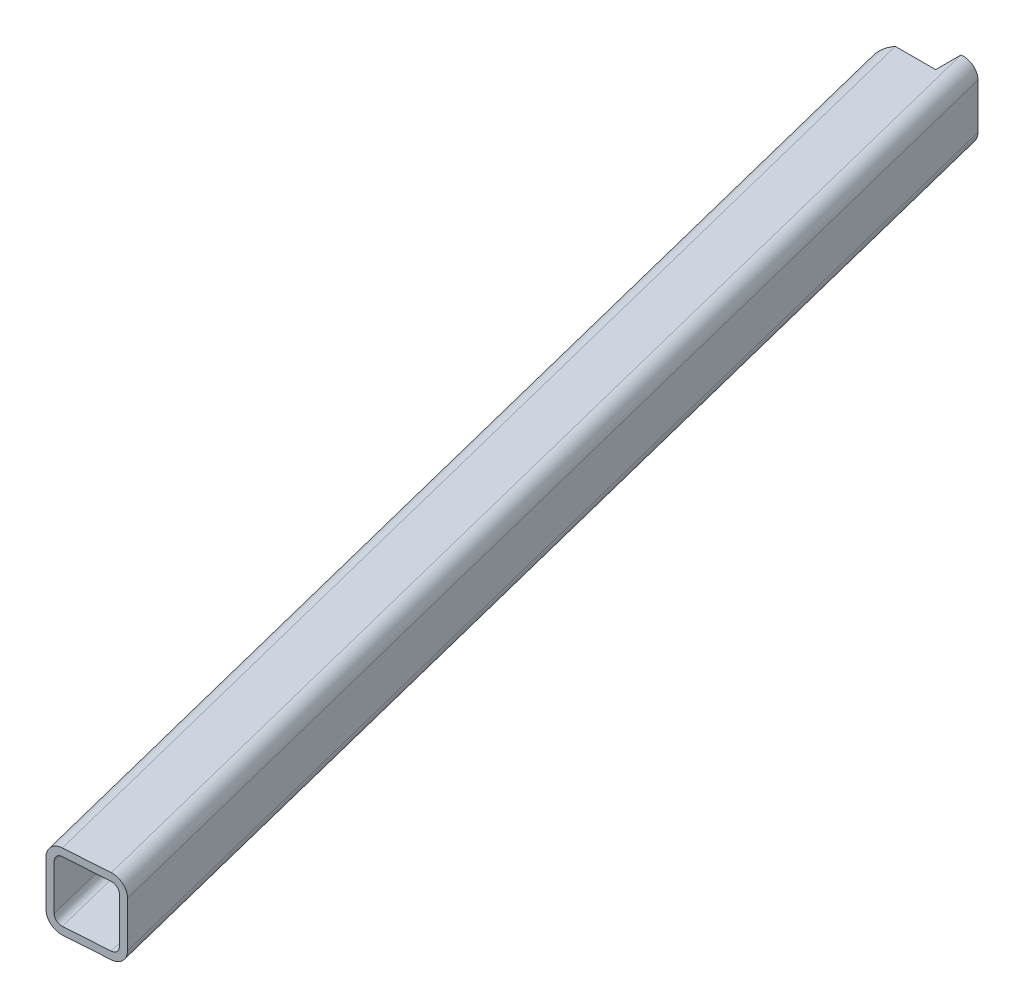
ISO-10303-21;
HEADER;
FILE_DESCRIPTION(('STEP AP214'),'2;1');
FILE_NAME('part.step','',(''),(''),'','','');
FILE_SCHEMA(('AUTOMOTIVE_DESIGN { 1 0 10303 214 1 1 1 1 }'));
ENDSEC;
DATA;
#1=APPLICATION_CONTEXT('core data for automotive mechanical design processes');
#2=APPLICATION_PROTOCOL_DEFINITION('international standard','automotive_design',2000,#1);
#3=PRODUCT_CONTEXT('',#1,'mechanical');
#4=PRODUCT('Part','Part','',(#3));
#5=PRODUCT_RELATED_PRODUCT_CATEGORY('part','',(#4));
#6=PRODUCT_DEFINITION_FORMATION('','',#4);
#7=PRODUCT_DEFINITION_CONTEXT('part definition',#1,'design');
#8=PRODUCT_DEFINITION('design','',#6,#7);
#9=PRODUCT_DEFINITION_SHAPE('','',#8);
#10=(LENGTH_UNIT() NAMED_UNIT(*) SI_UNIT(.MILLI.,.METRE.));
#11=(NAMED_UNIT(*) PLANE_ANGLE_UNIT() SI_UNIT($,.RADIAN.));
#12=(NAMED_UNIT(*) SI_UNIT($,.STERADIAN.) SOLID_ANGLE_UNIT());
#13=UNCERTAINTY_MEASURE_WITH_UNIT(LENGTH_MEASURE(1.E-05),#10,'distance_accuracy_value','');
#14=(GEOMETRIC_REPRESENTATION_CONTEXT(3) GLOBAL_UNCERTAINTY_ASSIGNED_CONTEXT((#13)) GLOBAL_UNIT_ASSIGNED_CONTEXT((#10,
#11,#12)) REPRESENTATION_CONTEXT('',''));
#15=CARTESIAN_POINT('',(0.,0.,0.));
#16=DIRECTION('',(0.,0.,1.));
#17=DIRECTION('',(1.,0.,0.));
#18=AXIS2_PLACEMENT_3D('',#15,#16,#17);
#19=CARTESIAN_POINT('',(167.238859998837,6.00000000000001,-1998.05971499971));
#20=DIRECTION('',(0.970142500145332,0.,-0.242535625036333));
#21=DIRECTION('',(-0.242535625036333,0.,-0.970142500145332));
#22=AXIS2_PLACEMENT_3D('',#19,#20,#21);
#23=PLANE('',#22);
#24=DIRECTION('',(0.242535625036333,0.,0.970142500145332));
#25=VECTOR('',#24,1.);
#26=CARTESIAN_POINT('',(167.238859998837,-6.00000000000001,-1998.05971499971));
#27=LINE('',#26,#25);
#28=CARTESIAN_POINT('',(169.253788748765,-6.00000000000001,-1990.));
#29=VERTEX_POINT('',#28);
#30=CARTESIAN_POINT('',(241.88701922979,-6.00000000000001,-1699.4670780759));
#31=VERTEX_POINT('',#30);
#32=EDGE_CURVE('E332',#29,#31,#27,.T.);
#33=ORIENTED_EDGE('',*,*,#32,.F.);
#34=DIRECTION('',(0.,1.,0.));
#35=VECTOR('',#34,1.);
#36=CARTESIAN_POINT('',(169.253788748765,6.00000000000001,-1990.));
#37=LINE('',#36,#35);
#38=CARTESIAN_POINT('',(169.253788748765,6.00000000000001,-1990.));
#39=VERTEX_POINT('',#38);
#40=EDGE_CURVE('E11',#29,#39,#37,.T.);
#41=ORIENTED_EDGE('',*,*,#40,.T.);
#42=DIRECTION('',(0.242535625036333,0.,0.970142500145332));
#43=VECTOR('',#42,1.);
#44=CARTESIAN_POINT('',(167.238859998837,6.00000000000001,-1998.05971499971));
#45=LINE('',#44,#43);
#46=CARTESIAN_POINT('',(241.88701922979,6.00000000000001,-1699.4670780759));
#47=VERTEX_POINT('',#46);
#48=EDGE_CURVE('E345',#39,#47,#45,.T.);
#49=ORIENTED_EDGE('',*,*,#48,.T.);
#50=DIRECTION('',(0.,-1.,0.));
#51=VECTOR('',#50,1.);
#52=CARTESIAN_POINT('',(241.88701922979,6.00000000000001,-1699.4670780759));
#53=LINE('',#52,#51);
#54=EDGE_CURVE('E335',#47,#31,#53,.T.);
#55=ORIENTED_EDGE('',*,*,#54,.T.);
#56=EDGE_LOOP('',(#33,#41,#49,#55));
#57=FACE_BOUND('',#56,.T.);
#58=ADVANCED_FACE('F41',(#57),#23,.T.);
#59=CARTESIAN_POINT('',(169.179144999128,6.00000000000001,-1998.54478624978));
#60=DIRECTION('',(0.242535625036333,0.,0.970142500145332));
#61=DIRECTION('',(0.970142500145332,0.,-0.242535625036333));
#62=AXIS2_PLACEMENT_3D('',#59,#60,#61);
#63=CYLINDRICAL_SURFACE('',#62,2.);
#64=ORIENTED_EDGE('',*,*,#48,.F.);
#65=CARTESIAN_POINT('',(169.253788748765,6.00000000000001,-1990.));
#66=CARTESIAN_POINT('',(169.2537844173,6.05541227681401,-1989.99999047117));
#67=CARTESIAN_POINT('',(169.255874593308,6.11082041195172,-1990.00115122343));
#68=CARTESIAN_POINT('',(169.264209391385,6.22121798911677,-1990.00574233988));
#69=CARTESIAN_POINT('',(169.270453187011,6.27620751223406,-1990.00917225256));
#70=CARTESIAN_POINT('',(169.287040162992,6.38524494053364,-1990.01821960056));
#71=CARTESIAN_POINT('',(169.297373176059,6.43929483662927,-1990.02383160979));
#72=CARTESIAN_POINT('',(169.322065593627,6.54619636213333,-1990.03709998784));
#73=CARTESIAN_POINT('',(169.336425079979,6.59904796715902,-1990.04475639822));
#74=CARTESIAN_POINT('',(169.385426092638,6.75523603264174,-1990.07053389349));
#75=CARTESIAN_POINT('',(169.426008596506,6.8563265228954,-1990.0914738324));
#76=CARTESIAN_POINT('',(169.522159922182,7.04968732301922,-1990.13889868098));
#77=CARTESIAN_POINT('',(169.577738116249,7.14195206781216,-1990.16538705608));
#78=CARTESIAN_POINT('',(169.704355729337,7.31735079965791,-1990.22200279201));
#79=CARTESIAN_POINT('',(169.775714635614,7.40023289573802,-1990.25219857235));
#80=CARTESIAN_POINT('',(169.931940731191,7.55214452034187,-1990.31251612127));
#81=CARTESIAN_POINT('',(170.01680466097,7.62117738239877,-1990.34263790593));
#82=CARTESIAN_POINT('',(170.197464661589,7.74265201692883,-1990.39894271106));
#83=CARTESIAN_POINT('',(170.293133332521,7.79526425162434,-1990.42516461096));
#84=CARTESIAN_POINT('',(170.493670527779,7.88307555410435,-1990.47062422761));
#85=CARTESIAN_POINT('',(170.598529783074,7.91829193361807,-1990.48986888277));
#86=CARTESIAN_POINT('',(170.783431322946,7.96299109188665,-1990.51472546731));
#87=CARTESIAN_POINT('',(170.862123216528,7.9769318962095,-1990.52265221653));
#88=CARTESIAN_POINT('',(171.020995374399,7.99546091562148,-1990.53327871374));
#89=CARTESIAN_POINT('',(171.101176438875,8.00004394656063,-1990.53597556434));
#90=CARTESIAN_POINT('',(171.181366965358,8.00000000000001,-1990.53589838486));
#91=B_SPLINE_CURVE_WITH_KNOTS('',3,(#65,#66,#67,#68,#69,#70,#71,#72,#73,#74,#75,#76,#77,#78,#79,
#80,#81,#82,#83,#84,#85,#86,#87,#88,#89,#90),.UNSPECIFIED.,.F.,.F.,(4,2,2,2,2,2,2,2,2,2,2,2,4),
(0.,0.166178181769756,0.332323309063444,0.498057908438426,0.663795877148359,0.994908532908496,
1.32622861431457,1.6649969087039,2.00368356292043,2.33872741602138,2.67343717041519,
2.91366183826913,3.15401955307085),.UNSPECIFIED.);
#92=CARTESIAN_POINT('',(171.181366965358,8.00000000000001,-1990.53589838486));
#93=VERTEX_POINT('',#92);
#94=EDGE_CURVE('E418',#39,#93,#91,.T.);
#95=ORIENTED_EDGE('',*,*,#94,.T.);
#96=DIRECTION('',(0.242535625036333,0.,0.970142500145332));
#97=VECTOR('',#96,1.);
#98=CARTESIAN_POINT('',(169.179144999128,8.00000000000001,-1998.54478624978));
#99=LINE('',#98,#97);
#100=CARTESIAN_POINT('',(243.915264422343,8.00000000000001,-1699.60030855692));
#101=VERTEX_POINT('',#100);
#102=EDGE_CURVE('E391',#93,#101,#99,.T.);
#103=ORIENTED_EDGE('',*,*,#102,.T.);
#104=CARTESIAN_POINT('',(243.915264422343,6.00000000000001,-1699.60030855692));
#105=DIRECTION('',(0.0655463023942972,0.,0.997849528858152));
#106=DIRECTION('',(0.997849528858152,0.,-0.0655463023942972));
#107=AXIS2_PLACEMENT_3D('',#104,#105,#106);
#108=ELLIPSE('',#107,2.03261627519472,2.);
#109=EDGE_CURVE('E392',#101,#47,#108,.T.);
#110=ORIENTED_EDGE('',*,*,#109,.T.);
#111=EDGE_LOOP('',(#64,#95,#103,#110));
#112=FACE_BOUND('',#111,.T.);
#113=ADVANCED_FACE('F323',(#112),#63,.F.);
#114=CARTESIAN_POINT('',(169.179144999128,8.00000000000001,-1998.54478624978));
#115=DIRECTION('',(0.,-1.,0.));
#116=DIRECTION('',(0.,0.,-1.));
#117=AXIS2_PLACEMENT_3D('',#114,#115,#116);
#118=PLANE('',#117);
#119=ORIENTED_EDGE('',*,*,#102,.F.);
#120=DIRECTION('',(-1.,0.,0.));
#121=VECTOR('',#120,1.);
#122=CARTESIAN_POINT('',(175.,8.00000000000001,-1990.53589838486));
#123=LINE('',#122,#121);
#124=CARTESIAN_POINT('',(183.550683842211,8.00000000000001,-1990.53589838486));
#125=VERTEX_POINT('',#124);
#126=EDGE_CURVE('E257',#93,#125,#123,.F.);
#127=ORIENTED_EDGE('',*,*,#126,.T.);
#128=DIRECTION('',(0.242535625036333,0.,0.970142500145332));
#129=VECTOR('',#128,1.);
#130=CARTESIAN_POINT('',(180.820855000872,8.00000000000001,-2001.45521375022));
#131=LINE('',#130,#129);
#132=CARTESIAN_POINT('',(256.084735577657,8.00000000000001,-1700.39969144308));
#133=VERTEX_POINT('',#132);
#134=EDGE_CURVE('E387',#125,#133,#131,.T.);
#135=ORIENTED_EDGE('',*,*,#134,.T.);
#136=DIRECTION('',(-0.997849528858152,0.,0.0655463023942972));
#137=VECTOR('',#136,1.);
#138=CARTESIAN_POINT('',(189.052802402175,8.00000000000001,-1695.99652720345));
#139=LINE('',#138,#137);
#140=EDGE_CURVE('E388',#133,#101,#139,.T.);
#141=ORIENTED_EDGE('',*,*,#140,.T.);
#142=EDGE_LOOP('',(#119,#127,#135,#141));
#143=FACE_BOUND('',#142,.T.);
#144=ADVANCED_FACE('F246',(#143),#118,.T.);
#145=CARTESIAN_POINT('',(180.820855000872,6.00000000000001,-2001.45521375022));
#146=DIRECTION('',(0.242535625036333,0.,0.970142500145332));
#147=DIRECTION('',(0.970142500145332,0.,-0.242535625036333));
#148=AXIS2_PLACEMENT_3D('',#145,#146,#147);
#149=CYLINDRICAL_SURFACE('',#148,2.);
#150=CARTESIAN_POINT('',(183.550683842211,8.00000000000001,-1990.53589838486));
#151=CARTESIAN_POINT('',(183.610151480909,8.00000572722065,-1990.53591470458));
#152=CARTESIAN_POINT('',(183.66958974251,7.9975040424111,-1990.53445731727));
#153=CARTESIAN_POINT('',(183.787878122978,7.9877278193583,-1990.52883402798));
#154=CARTESIAN_POINT('',(183.846728843419,7.98045881366243,-1990.52467126566));
#155=CARTESIAN_POINT('',(183.963068049205,7.96145167017845,-1990.51391064367));
#156=CARTESIAN_POINT('',(184.020562956046,7.94974330076173,-1990.50732901266));
#157=CARTESIAN_POINT('',(184.134237693236,7.92209778493949,-1990.49203911526));
#158=CARTESIAN_POINT('',(184.190417132153,7.90615939681974,-1990.48333022447));
#159=CARTESIAN_POINT('',(184.355995931722,7.85250480290469,-1990.45459796619));
#160=CARTESIAN_POINT('',(184.463064983863,7.80884245284905,-1990.43190441305));
#161=CARTESIAN_POINT('',(184.669156698236,7.70694340160602,-1990.38205009575));
#162=CARTESIAN_POINT('',(184.768156336087,7.64866680659164,-1990.35487717458));
#163=CARTESIAN_POINT('',(184.969032051302,7.50954942543418,-1990.29490069528));
#164=CARTESIAN_POINT('',(185.069462361515,7.42671616115522,-1990.26183439137));
#165=CARTESIAN_POINT('',(185.2542638948,7.24428961846161,-1990.19722878263));
#166=CARTESIAN_POINT('',(185.338657755139,7.14472034494214,-1990.16568737288));
#167=CARTESIAN_POINT('',(185.469869622932,6.95525072204998,-1990.11480513234));
#168=CARTESIAN_POINT('',(185.520859092869,6.86854401072411,-1990.09433673566));
#169=CARTESIAN_POINT('',(185.608648946627,6.68740332393944,-1990.05843266473));
#170=CARTESIAN_POINT('',(185.64548451381,6.59298922573626,-1990.04298452622));
#171=CARTESIAN_POINT('',(185.697701345881,6.41594783608613,-1990.02087305481));
#172=CARTESIAN_POINT('',(185.715746877671,6.33424704892738,-1990.01313056431));
#173=CARTESIAN_POINT('',(185.733948309541,6.20999147664818,-1990.00529774502));
#174=CARTESIAN_POINT('',(185.738537941311,6.16816743801789,-1990.00331676254));
#175=CARTESIAN_POINT('',(185.744672288111,6.08423443665052,-1990.00066589761));
#176=CARTESIAN_POINT('',(185.746215455897,6.04212534002554,-1989.99999668139));
#177=CARTESIAN_POINT('',(185.746211251235,6.00000000000001,-1990.));
#178=B_SPLINE_CURVE_WITH_KNOTS('',3,(#150,#151,#152,#153,#154,#155,#156,#157,#158,#159,#160,
#161,#162,#163,#164,#165,#166,#167,#168,#169,#170,#171,#172,#173,#174,#175,#176,#177),
.UNSPECIFIED.,.F.,.F.,(4,2,2,2,2,2,2,2,2,2,2,2,2,4),(0.,0.178288272495279,0.356370004029697,
0.533278133580795,0.710238251738084,1.06225629773994,1.41524594351551,1.8163281813049,
2.21683997019756,2.52358699355294,2.82956650366638,3.08062005864679,3.20686730023658,
3.33317864404818),.UNSPECIFIED.);
#179=CARTESIAN_POINT('',(184.601781772694,7.73987587542688,-1990.39821822731));
#180=VERTEX_POINT('',#179);
#181=EDGE_CURVE('E250',#125,#180,#178,.T.);
#182=ORIENTED_EDGE('',*,*,#181,.T.);
#183=CARTESIAN_POINT('',(184.478786136005,7.97434723894774,-1988.14));
#184=CARTESIAN_POINT('',(184.481700281451,7.96920668597593,-1988.25920524378));
#185=CARTESIAN_POINT('',(184.485083979784,7.96322352953446,-1988.37836738853));
#186=CARTESIAN_POINT('',(184.492870151616,7.94934035615619,-1988.61656538519));
#187=CARTESIAN_POINT('',(184.497272790874,7.94144002732626,-1988.73560121337));
#188=CARTESIAN_POINT('',(184.507194524947,7.92345811015888,-1988.97392181032));
#189=CARTESIAN_POINT('',(184.512717819045,7.91336830730373,-1989.09320579382));
#190=CARTESIAN_POINT('',(184.52495705148,7.89072585816869,-1989.33147451648));
#191=CARTESIAN_POINT('',(184.531672925706,7.87817334427721,-1989.45045927136));
#192=CARTESIAN_POINT('',(184.546382227661,7.8502492777656,-1989.68792010424));
#193=CARTESIAN_POINT('',(184.554374575947,7.83488010543132,-1989.80639652595));
#194=CARTESIAN_POINT('',(184.571733054011,7.80085779054606,-1990.04277445472));
#195=CARTESIAN_POINT('',(184.58109910266,7.78220484191523,-1990.16067599531));
#196=CARTESIAN_POINT('',(184.601279896416,7.74106521761009,-1990.3955105398));
#197=CARTESIAN_POINT('',(184.612092495528,7.71858420774271,-1990.51244471106));
#198=CARTESIAN_POINT('',(184.635252559635,7.66903880191109,-1990.74517323598));
#199=CARTESIAN_POINT('',(184.647599658506,7.64197549870511,-1990.86096785443));
#200=CARTESIAN_POINT('',(184.668167941667,7.59526847979233,-1991.04097869987));
#201=CARTESIAN_POINT('',(184.675850929388,7.57750998408277,-1991.10574562601));
#202=CARTESIAN_POINT('',(184.691722460109,7.53999901474844,-1991.23463724598));
#203=CARTESIAN_POINT('',(184.699911037676,7.52024640472504,-1991.29876189554));
#204=CARTESIAN_POINT('',(184.725308575034,7.45744766066818,-1991.49054685902));
#205=CARTESIAN_POINT('',(184.743284334683,7.41100399075474,-1991.61704698039));
#206=CARTESIAN_POINT('',(184.774144447964,7.32554339628438,-1991.8197992543));
#207=CARTESIAN_POINT('',(184.786501131717,7.28997418057812,-1991.89758496113));
#208=CARTESIAN_POINT('',(184.811788438994,7.21322289891921,-1992.0503524144));
#209=CARTESIAN_POINT('',(184.824719456628,7.1720369373278,-1992.12533216829));
#210=CARTESIAN_POINT('',(184.850784222029,7.08332186883694,-1992.27075264376));
#211=CARTESIAN_POINT('',(184.863916043252,7.03583688553992,-1992.34122029593));
#212=CARTESIAN_POINT('',(184.889981647499,6.93319094764241,-1992.47628452919));
#213=CARTESIAN_POINT('',(184.90291577127,6.87804538379551,-1992.54089246313));
#214=CARTESIAN_POINT('',(184.924961049935,6.7725741369456,-1992.64773789062));
#215=CARTESIAN_POINT('',(184.934267365779,6.72405618056436,-1992.69170314797));
#216=CARTESIAN_POINT('',(184.951792166913,6.62133040013761,-1992.77287135961));
#217=CARTESIAN_POINT('',(184.960009998561,6.56711919196733,-1992.8100702556));
#218=CARTESIAN_POINT('',(184.974756281794,6.45243195320102,-1992.87582072592));
#219=CARTESIAN_POINT('',(184.981261731954,6.39188453540535,-1992.90425536346));
#220=CARTESIAN_POINT('',(184.991614131838,6.26633334482905,-1992.94910659918));
#221=CARTESIAN_POINT('',(184.995470651217,6.20134655585666,-1992.96556647087));
#222=CARTESIAN_POINT('',(184.998467575897,6.1129993678928,-1992.97833180178));
#223=CARTESIAN_POINT('',(184.999040685795,6.09047743197025,-1992.98076912356));
#224=CARTESIAN_POINT('',(184.999806873219,6.04530816188554,-1992.98402532372));
#225=CARTESIAN_POINT('',(184.999999910469,6.02266081468914,-1992.98484403058));
#226=CARTESIAN_POINT('',(185.,5.99999999999994,-1992.98484500494));
#227=B_SPLINE_CURVE_WITH_KNOTS('',3,(#183,#184,#185,#186,#187,#188,#189,#190,#191,#192,#193,
#194,#195,#196,#197,#198,#199,#200,#201,#202,#203,#204,#205,#206,#207,#208,#209,#210,#211,#212,
#213,#214,#215,#216,#217,#218,#219,#220,#221,#222,#223,#224,#225,#226),.UNSPECIFIED.,.F.,.F.,(4,
2,2,2,2,2,2,2,2,2,2,2,2,2,2,2,2,2,2,2,2,4),(0.,0.358057915367871,0.716174120097957,
1.075657888224,1.43512233680736,1.79428440034095,2.15342526102741,2.51203911553635,
2.87056757006999,3.07332113519425,3.27608857819396,3.68339784412072,3.94248600754156,
4.20175479089893,4.45929490956473,4.71632489672479,4.91424926045921,5.11229194550438,
5.31287280322568,5.51272516682829,5.58065851949562,5.64859907032818),.UNSPECIFIED.);
#228=CARTESIAN_POINT('',(185.,6.00000000000001,-1992.98484500494));
#229=VERTEX_POINT('',#228);
#230=EDGE_CURVE('E172',#180,#229,#227,.T.);
#231=ORIENTED_EDGE('',*,*,#230,.T.);
#232=DIRECTION('',(0.242535625036333,0.,0.970142500145332));
#233=VECTOR('',#232,1.);
#234=CARTESIAN_POINT('',(182.761140001163,6.00000000000001,-2001.94028500029));
#235=LINE('',#234,#233);
#236=CARTESIAN_POINT('',(258.11298077021,6.00000000000001,-1700.5329219241));
#237=VERTEX_POINT('',#236);
#238=EDGE_CURVE('E383',#229,#237,#235,.T.);
#239=ORIENTED_EDGE('',*,*,#238,.T.);
#240=CARTESIAN_POINT('',(256.084735577657,6.00000000000001,-1700.39969144308));
#241=DIRECTION('',(0.0655463023942972,0.,0.997849528858152));
#242=DIRECTION('',(0.997849528858152,0.,-0.0655463023942972));
#243=AXIS2_PLACEMENT_3D('',#240,#241,#242);
#244=ELLIPSE('',#243,2.03261627519472,2.);
#245=EDGE_CURVE('E384',#237,#133,#244,.T.);
#246=ORIENTED_EDGE('',*,*,#245,.T.);
#247=ORIENTED_EDGE('',*,*,#134,.F.);
#248=EDGE_LOOP('',(#182,#231,#239,#246,#247));
#249=FACE_BOUND('',#248,.T.);
#250=ADVANCED_FACE('F241',(#249),#149,.F.);
#251=CARTESIAN_POINT('',(182.761140001163,-6.00000000000001,-2001.94028500029));
#252=DIRECTION('',(-0.970142500145332,0.,0.242535625036333));
#253=DIRECTION('',(0.242535625036333,0.,0.970142500145332));
#254=AXIS2_PLACEMENT_3D('',#251,#252,#253);
#255=PLANE('',#254);
#256=ORIENTED_EDGE('',*,*,#238,.F.);
#257=DIRECTION('',(0.,-1.,0.));
#258=VECTOR('',#257,1.);
#259=CARTESIAN_POINT('',(185.,-6.00000000000001,-1992.98484500494));
#260=LINE('',#259,#258);
#261=CARTESIAN_POINT('',(185.,-6.00000000000001,-1992.98484500494));
#262=VERTEX_POINT('',#261);
#263=EDGE_CURVE('E239',#229,#262,#260,.T.);
#264=ORIENTED_EDGE('',*,*,#263,.T.);
#265=DIRECTION('',(0.242535625036333,0.,0.970142500145332));
#266=VECTOR('',#265,1.);
#267=CARTESIAN_POINT('',(182.761140001163,-6.00000000000001,-2001.94028500029));
#268=LINE('',#267,#266);
#269=CARTESIAN_POINT('',(258.11298077021,-6.00000000000001,-1700.5329219241));
#270=VERTEX_POINT('',#269);
#271=EDGE_CURVE('E379',#262,#270,#268,.T.);
#272=ORIENTED_EDGE('',*,*,#271,.T.);
#273=DIRECTION('',(0.,1.,0.));
#274=VECTOR('',#273,1.);
#275=CARTESIAN_POINT('',(258.11298077021,-6.00000000000001,-1700.5329219241));
#276=LINE('',#275,#274);
#277=EDGE_CURVE('E380',#270,#237,#276,.T.);
#278=ORIENTED_EDGE('',*,*,#277,.T.);
#279=EDGE_LOOP('',(#256,#264,#272,#278));
#280=FACE_BOUND('',#279,.T.);
#281=ADVANCED_FACE('F245',(#280),#255,.T.);
#282=CARTESIAN_POINT('',(180.820855000872,-6.00000000000001,-2001.45521375022));
#283=DIRECTION('',(0.242535625036333,0.,0.970142500145332));
#284=DIRECTION('',(0.970142500145332,0.,-0.242535625036333));
#285=AXIS2_PLACEMENT_3D('',#282,#283,#284);
#286=CYLINDRICAL_SURFACE('',#285,2.);
#287=ORIENTED_EDGE('',*,*,#271,.F.);
#288=CARTESIAN_POINT('',(185.,-6.00000000000001,-1992.98484500494));
#289=CARTESIAN_POINT('',(185.000001919551,-6.02761845763185,-1992.98485061943));
#290=CARTESIAN_POINT('',(184.999713668837,-6.05522140064881,-1992.98362938483));
#291=CARTESIAN_POINT('',(184.998576225856,-6.11018345239516,-1992.97879463063));
#292=CARTESIAN_POINT('',(184.997727488139,-6.13754274051946,-1992.97518304959));
#293=CARTESIAN_POINT('',(184.994389981888,-6.21849170817814,-1992.96094179255));
#294=CARTESIAN_POINT('',(184.991109138876,-6.27147990262463,-1992.94690302008));
#295=CARTESIAN_POINT('',(184.982786162469,-6.37427056731089,-1992.91087331779));
#296=CARTESIAN_POINT('',(184.977749207021,-6.42408189938312,-1992.88890575959));
#297=CARTESIAN_POINT('',(184.966331439773,-6.52015466627055,-1992.83836420857));
#298=CARTESIAN_POINT('',(184.959947514974,-6.56640753316891,-1992.80977489691));
#299=CARTESIAN_POINT('',(184.941594080695,-6.68522561384396,-1992.72610360494));
#300=CARTESIAN_POINT('',(184.928779791177,-6.75427828899169,-1992.66623227247));
#301=CARTESIAN_POINT('',(184.902049595741,-6.88221528365527,-1992.53670806784));
#302=CARTESIAN_POINT('',(184.888130780072,-6.94107135097303,-1992.46702895806));
#303=CARTESIAN_POINT('',(184.861550263647,-7.04449628152902,-1992.3285874968));
#304=CARTESIAN_POINT('',(184.848903126588,-7.0899070550435,-1992.26043950612));
#305=CARTESIAN_POINT('',(184.823874258178,-7.1747092970157,-1992.12041291992));
#306=CARTESIAN_POINT('',(184.811492767252,-7.21409549536257,-1992.04853113097));
#307=CARTESIAN_POINT('',(184.787219897348,-7.28781694069073,-1991.90196175207));
#308=CARTESIAN_POINT('',(184.775329699551,-7.32214047287777,-1991.82726814146));
#309=CARTESIAN_POINT('',(184.752210159511,-7.38639117452061,-1991.67596606098));
#310=CARTESIAN_POINT('',(184.740980581785,-7.41631991629839,-1991.59935828747));
#311=CARTESIAN_POINT('',(184.713976670565,-7.48606413297498,-1991.40715662038));
#312=CARTESIAN_POINT('',(184.698641712027,-7.52362834007715,-1991.29068623193));
#313=CARTESIAN_POINT('',(184.669658046822,-7.59216348177899,-1991.05559198812));
#314=CARTESIAN_POINT('',(184.656010220497,-7.62313098026927,-1990.93696704524));
#315=CARTESIAN_POINT('',(184.630360812124,-7.67971584816818,-1990.6980656628));
#316=CARTESIAN_POINT('',(184.618362142852,-7.70532379206717,-1990.57778670367));
#317=CARTESIAN_POINT('',(184.595965960226,-7.75205527685463,-1990.3362029684));
#318=CARTESIAN_POINT('',(184.585568731869,-7.77317801979832,-1990.21489801371));
#319=CARTESIAN_POINT('',(184.566258185557,-7.81170297466976,-1989.97125486162));
#320=CARTESIAN_POINT('',(184.557348888188,-7.82909514098515,-1989.84891477414));
#321=CARTESIAN_POINT('',(184.540945808072,-7.86064907861059,-1989.60372080676));
#322=CARTESIAN_POINT('',(184.533452149882,-7.87481056568997,-1989.48086688263));
#323=CARTESIAN_POINT('',(184.512954697166,-7.91311526908585,-1989.11202195456));
#324=CARTESIAN_POINT('',(184.501913973121,-7.93311830882902,-1988.86548341331));
#325=CARTESIAN_POINT('',(184.490270583881,-7.95398009998398,-1988.53879358623));
#326=CARTESIAN_POINT('',(184.487659593153,-7.95863515834066,-1988.45891800723));
#327=CARTESIAN_POINT('',(184.482891913228,-7.96710192919436,-1988.29936986794));
#328=CARTESIAN_POINT('',(184.480733770642,-7.97091634174073,-1988.21969749477));
#329=CARTESIAN_POINT('',(184.478786136003,-7.97434723895025,-1988.14));
#330=B_SPLINE_CURVE_WITH_KNOTS('',3,(#288,#289,#290,#291,#292,#293,#294,#295,#296,#297,#298,
#299,#300,#301,#302,#303,#304,#305,#306,#307,#308,#309,#310,#311,#312,#313,#314,#315,#316,#317,
#318,#319,#320,#321,#322,#323,#324,#325,#326,#327,#328,#329),.UNSPECIFIED.,.F.,.F.,(4,2,2,2,2,2,
2,2,2,2,2,2,2,2,2,2,2,2,2,2,4),(0.,0.0827977683075952,0.165528470664292,0.329430007782095,
0.492852307515945,0.656656514749558,0.931926362060952,1.20794712032601,1.45617052501262,
1.70460984108007,1.95361530809691,2.20253147035682,2.57225442859995,2.94216950064825,
3.31272975173565,3.68335587263351,4.05496781489803,4.4266124384682,5.16909831818516,
5.40925800740176,5.64863471282992),.UNSPECIFIED.);
#331=CARTESIAN_POINT('',(184.601781772694,-7.73987587542678,-1990.39821822731));
#332=VERTEX_POINT('',#331);
#333=EDGE_CURVE('E175',#262,#332,#330,.T.);
#334=ORIENTED_EDGE('',*,*,#333,.T.);
#335=CARTESIAN_POINT('',(185.746211251235,-6.00000000000001,-1990.));
#336=CARTESIAN_POINT('',(185.746224383454,-6.04896715818431,-1989.99999097312));
#337=CARTESIAN_POINT('',(185.74413322209,-6.09792594762481,-1990.00089889839));
#338=CARTESIAN_POINT('',(185.735843719473,-6.19539736288344,-1990.0044803187));
#339=CARTESIAN_POINT('',(185.72964815251,-6.24391026764673,-1990.00715262115));
#340=CARTESIAN_POINT('',(185.713308116559,-6.33979250511959,-1990.01417009974));
#341=CARTESIAN_POINT('',(185.703191461001,-6.38716745040503,-1990.01850349094));
#342=CARTESIAN_POINT('',(185.679191975587,-6.48077393195599,-1990.02871851908));
#343=CARTESIAN_POINT('',(185.665308697069,-6.52700533129184,-1990.03460034044));
#344=CARTESIAN_POINT('',(185.61839841555,-6.66329922026783,-1990.05431637548));
#345=CARTESIAN_POINT('',(185.580054043862,-6.7512838660015,-1990.07024633101));
#346=CARTESIAN_POINT('',(185.491129307056,-6.91993494711506,-1990.10626162268));
#347=CARTESIAN_POINT('',(185.440529637662,-7.00058955798254,-1990.12635350731));
#348=CARTESIAN_POINT('',(185.323721841197,-7.16087534691876,-1990.17117121502));
#349=CARTESIAN_POINT('',(185.256488649627,-7.23968432098827,-1990.19615578589));
#350=CARTESIAN_POINT('',(185.111707552761,-7.38679155130582,-1990.24728252792));
#351=CARTESIAN_POINT('',(185.034149497414,-7.45507932011358,-1990.27342582108));
#352=CARTESIAN_POINT('',(184.853862204309,-7.59334819072161,-1990.33013748644));
#353=CARTESIAN_POINT('',(184.749209766333,-7.66089887484178,-1990.36053627516));
#354=CARTESIAN_POINT('',(184.529747610257,-7.77910839275997,-1990.41683608815));
#355=CARTESIAN_POINT('',(184.414952034846,-7.82979029086329,-1990.44274323033));
#356=CARTESIAN_POINT('',(184.237199298753,-7.89185151166693,-1990.47559404161));
#357=CARTESIAN_POINT('',(184.177152312549,-7.91018793459536,-1990.48552821345));
#358=CARTESIAN_POINT('',(184.055450743361,-7.94201842792535,-1990.50301643532));
#359=CARTESIAN_POINT('',(183.99379673998,-7.95551421896753,-1990.51057133097));
#360=CARTESIAN_POINT('',(183.868944178657,-7.97742886385126,-1990.522940399));
#361=CARTESIAN_POINT('',(183.805738808762,-7.98581827142631,-1990.52773866638));
#362=CARTESIAN_POINT('',(183.678597327918,-7.9971113032285,-1990.5342304944));
#363=CARTESIAN_POINT('',(183.614660310863,-8.00000716164336,-1990.53591965984));
#364=CARTESIAN_POINT('',(183.550683842211,-8.00000000000001,-1990.53589838486));
#365=B_SPLINE_CURVE_WITH_KNOTS('',3,(#335,#336,#337,#338,#339,#340,#341,#342,#343,#344,#345,
#346,#347,#348,#349,#350,#351,#352,#353,#354,#355,#356,#357,#358,#359,#360,#361,#362,#363,#364),
.UNSPECIFIED.,.F.,.F.,(4,2,2,2,2,2,2,2,2,2,2,2,2,2,4),(0.,0.146834761153019,0.293570373468533,
0.43928365317412,0.585014297131164,0.875503111195113,1.16645250724899,1.48498990355311,
1.80384278891793,2.18693202567758,2.56949530071481,2.75998699369149,2.95041090763842,
3.14192275867768,3.33370513428863),.UNSPECIFIED.);
#366=CARTESIAN_POINT('',(183.550683842211,-8.00000000000001,-1990.53589838486));
#367=VERTEX_POINT('',#366);
#368=EDGE_CURVE('E261',#332,#367,#365,.T.);
#369=ORIENTED_EDGE('',*,*,#368,.T.);
#370=DIRECTION('',(0.242535625036333,0.,0.970142500145332));
#371=VECTOR('',#370,1.);
#372=CARTESIAN_POINT('',(180.820855000872,-8.00000000000001,-2001.45521375022));
#373=LINE('',#372,#371);
#374=CARTESIAN_POINT('',(256.084735577657,-8.00000000000001,-1700.39969144308));
#375=VERTEX_POINT('',#374);
#376=EDGE_CURVE('E375',#367,#375,#373,.T.);
#377=ORIENTED_EDGE('',*,*,#376,.T.);
#378=CARTESIAN_POINT('',(256.084735577657,-6.00000000000001,-1700.39969144308));
#379=DIRECTION('',(0.0655463023942972,0.,0.997849528858152));
#380=DIRECTION('',(0.997849528858152,0.,-0.0655463023942972));
#381=AXIS2_PLACEMENT_3D('',#378,#379,#380);
#382=ELLIPSE('',#381,2.03261627519472,2.);
#383=EDGE_CURVE('E376',#375,#270,#382,.T.);
#384=ORIENTED_EDGE('',*,*,#383,.T.);
#385=EDGE_LOOP('',(#287,#334,#369,#377,#384));
#386=FACE_BOUND('',#385,.T.);
#387=ADVANCED_FACE('F209',(#386),#286,.F.);
#388=CARTESIAN_POINT('',(180.820855000872,-8.00000000000001,-2001.45521375022));
#389=DIRECTION('',(0.,1.,0.));
#390=DIRECTION('',(0.,0.,1.));
#391=AXIS2_PLACEMENT_3D('',#388,#389,#390);
#392=PLANE('',#391);
#393=ORIENTED_EDGE('',*,*,#376,.F.);
#394=DIRECTION('',(-1.,0.,0.));
#395=VECTOR('',#394,1.);
#396=CARTESIAN_POINT('',(175.,-8.00000000000001,-1990.53589838486));
#397=LINE('',#396,#395);
#398=CARTESIAN_POINT('',(171.181366965358,-8.00000000000001,-1990.53589838486));
#399=VERTEX_POINT('',#398);
#400=EDGE_CURVE('E269',#367,#399,#397,.T.);
#401=ORIENTED_EDGE('',*,*,#400,.T.);
#402=DIRECTION('',(0.242535625036333,0.,0.970142500145332));
#403=VECTOR('',#402,1.);
#404=CARTESIAN_POINT('',(169.179144999128,-8.00000000000001,-1998.54478624978));
#405=LINE('',#404,#403);
#406=CARTESIAN_POINT('',(243.915264422343,-8.00000000000001,-1699.60030855692));
#407=VERTEX_POINT('',#406);
#408=EDGE_CURVE('E340',#399,#407,#405,.T.);
#409=ORIENTED_EDGE('',*,*,#408,.T.);
#410=DIRECTION('',(0.997849528858152,0.,-0.0655463023942972));
#411=VECTOR('',#410,1.);
#412=CARTESIAN_POINT('',(200.834853438986,-8.00000000000001,-1696.77046140671));
#413=LINE('',#412,#411);
#414=EDGE_CURVE('E372',#407,#375,#413,.T.);
#415=ORIENTED_EDGE('',*,*,#414,.T.);
#416=EDGE_LOOP('',(#393,#401,#409,#415));
#417=FACE_BOUND('',#416,.T.);
#418=ADVANCED_FACE('F289',(#417),#392,.T.);
#419=CARTESIAN_POINT('',(169.179144999128,-6.00000000000001,-1998.54478624978));
#420=DIRECTION('',(0.242535625036333,0.,0.970142500145332));
#421=DIRECTION('',(0.970142500145332,0.,-0.242535625036333));
#422=AXIS2_PLACEMENT_3D('',#419,#420,#421);
#423=CYLINDRICAL_SURFACE('',#422,2.);
#424=ORIENTED_EDGE('',*,*,#408,.F.);
#425=CARTESIAN_POINT('',(171.181366965358,-8.00000000000001,-1990.53589838486));
#426=CARTESIAN_POINT('',(171.130815678858,-8.00000752405425,-1990.53591124016));
#427=CARTESIAN_POINT('',(171.080258716261,-7.99819634604764,-1990.53485738036));
#428=CARTESIAN_POINT('',(170.979499581221,-7.99087688892719,-1990.53064229677));
#429=CARTESIAN_POINT('',(170.92929742934,-7.98536839726962,-1990.52748095182));
#430=CARTESIAN_POINT('',(170.82979605732,-7.97062070242167,-1990.51909181607));
#431=CARTESIAN_POINT('',(170.780494273512,-7.96139475022925,-1990.51387136639));
#432=CARTESIAN_POINT('',(170.682999072482,-7.93922893192227,-1990.50149300269));
#433=CARTESIAN_POINT('',(170.634805563854,-7.92628937328789,-1990.49433524907));
#434=CARTESIAN_POINT('',(170.492314568163,-7.88192777966797,-1990.47019887443));
#435=CARTESIAN_POINT('',(170.400116547534,-7.84496428881587,-1990.45055802792));
#436=CARTESIAN_POINT('',(170.223874579621,-7.75726480335625,-1990.40633721655));
#437=CARTESIAN_POINT('',(170.13983444096,-7.70652241745681,-1990.38175496101));
#438=CARTESIAN_POINT('',(169.979910576913,-7.59149905889837,-1990.32968856036));
#439=CARTESIAN_POINT('',(169.904221572709,-7.52696963716146,-1990.30215654857));
#440=CARTESIAN_POINT('',(169.764103384757,-7.38658518679016,-1990.24725969681));
#441=CARTESIAN_POINT('',(169.699679415521,-7.31072494315939,-1990.21989493989));
#442=CARTESIAN_POINT('',(169.578057299305,-7.14255211488048,-1990.16554781241));
#443=CARTESIAN_POINT('',(169.521928475421,-7.04939122202395,-1990.13879279587));
#444=CARTESIAN_POINT('',(169.424960288601,-6.85404713124058,-1990.09094836199));
#445=CARTESIAN_POINT('',(169.384117018288,-6.75186624731845,-1990.06985749715));
#446=CARTESIAN_POINT('',(169.335245932955,-6.59486722594779,-1990.04412986904));
#447=CARTESIAN_POINT('',(169.321086682618,-6.54234916174067,-1990.03657643481));
#448=CARTESIAN_POINT('',(169.296740695948,-6.43613966414227,-1990.0234890807));
#449=CARTESIAN_POINT('',(169.286553844653,-6.3824482647553,-1990.01795510238));
#450=CARTESIAN_POINT('',(169.270207175452,-6.27417088495866,-1990.00903722782));
#451=CARTESIAN_POINT('',(169.264055497964,-6.21958332253818,-1990.00565767824));
#452=CARTESIAN_POINT('',(169.255843772174,-6.10999857846018,-1990.00113421872));
#453=CARTESIAN_POINT('',(169.253784548767,-6.05500131646342,-1989.99999075951));
#454=CARTESIAN_POINT('',(169.253788748765,-6.00000000000002,-1990.));
#455=B_SPLINE_CURVE_WITH_KNOTS('',3,(#425,#426,#427,#428,#429,#430,#431,#432,#433,#434,#435,
#436,#437,#438,#439,#440,#441,#442,#443,#444,#445,#446,#447,#448,#449,#450,#451,#452,#453,#454),
.UNSPECIFIED.,.F.,.F.,(4,2,2,2,2,2,2,2,2,2,2,2,2,2,4),(0.,0.151617545802354,0.303243808235909,
0.454334309254531,0.60541230384913,0.907598141329561,1.20992438678581,1.51824398533694,
1.82670592736261,2.16121140480461,2.49563131562698,2.66021840720866,2.82480073521785,
2.98971407294372,3.15466064808469),.UNSPECIFIED.);
#456=EDGE_CURVE('E275',#399,#29,#455,.T.);
#457=ORIENTED_EDGE('',*,*,#456,.T.);
#458=ORIENTED_EDGE('',*,*,#32,.T.);
#459=CARTESIAN_POINT('',(243.915264422343,-6.00000000000001,-1699.60030855692));
#460=DIRECTION('',(0.0655463023942972,0.,0.997849528858152));
#461=DIRECTION('',(0.997849528858152,0.,-0.0655463023942972));
#462=AXIS2_PLACEMENT_3D('',#459,#460,#461);
#463=ELLIPSE('',#462,2.03261627519472,2.);
#464=EDGE_CURVE('E338',#31,#407,#463,.T.);
#465=ORIENTED_EDGE('',*,*,#464,.T.);
#466=EDGE_LOOP('',(#424,#457,#458,#465));
#467=FACE_BOUND('',#466,.T.);
#468=ADVANCED_FACE('F285',(#467),#423,.F.);
#469=CARTESIAN_POINT('',(250.,0.,-1700.));
#470=DIRECTION('',(0.0655463023942972,0.,0.997849528858152));
#471=DIRECTION('',(0.997849528858152,0.,-0.0655463023942972));
#472=AXIS2_PLACEMENT_3D('',#469,#470,#471);
#473=PLANE('',#472);
#474=ORIENTED_EDGE('',*,*,#464,.F.);
#475=ORIENTED_EDGE('',*,*,#54,.F.);
#476=ORIENTED_EDGE('',*,*,#109,.F.);
#477=ORIENTED_EDGE('',*,*,#140,.F.);
#478=ORIENTED_EDGE('',*,*,#245,.F.);
#479=ORIENTED_EDGE('',*,*,#277,.F.);
#480=ORIENTED_EDGE('',*,*,#383,.F.);
#481=ORIENTED_EDGE('',*,*,#414,.F.);
#482=EDGE_LOOP('',(#474,#475,#476,#477,#478,#479,#480,#481));
#483=FACE_BOUND('',#482,.T.);
#484=DIRECTION('',(0.997849528858152,0.,-0.0655463023942972));
#485=VECTOR('',#484,1.);
#486=CARTESIAN_POINT('',(200.834853438986,-10.,-1696.77046140671));
#487=LINE('',#486,#485);
#488=CARTESIAN_POINT('',(243.915264422343,-10.,-1699.60030855692));
#489=VERTEX_POINT('',#488);
#490=CARTESIAN_POINT('',(256.084735577657,-10.,-1700.39969144308));
#491=VERTEX_POINT('',#490);
#492=EDGE_CURVE('E360',#489,#491,#487,.T.);
#493=ORIENTED_EDGE('',*,*,#492,.T.);
#494=CARTESIAN_POINT('',(256.084735577657,-6.00000000000001,-1700.39969144308));
#495=DIRECTION('',(0.0655463023942972,0.,0.997849528858152));
#496=DIRECTION('',(0.997849528858152,0.,-0.0655463023942972));
#497=AXIS2_PLACEMENT_3D('',#494,#495,#496);
#498=ELLIPSE('',#497,4.06523255038944,4.);
#499=CARTESIAN_POINT('',(260.141225962762,-6.00000000000001,-1700.66615240513));
#500=VERTEX_POINT('',#499);
#501=EDGE_CURVE('E397',#491,#500,#498,.T.);
#502=ORIENTED_EDGE('',*,*,#501,.T.);
#503=DIRECTION('',(0.,1.,0.));
#504=VECTOR('',#503,1.);
#505=CARTESIAN_POINT('',(260.141225962762,-6.00000000000001,-1700.66615240513));
#506=LINE('',#505,#504);
#507=CARTESIAN_POINT('',(260.141225962762,6.00000000000001,-1700.66615240513));
#508=VERTEX_POINT('',#507);
#509=EDGE_CURVE('E370',#500,#508,#506,.T.);
#510=ORIENTED_EDGE('',*,*,#509,.T.);
#511=CARTESIAN_POINT('',(256.084735577657,6.00000000000001,-1700.39969144308));
#512=DIRECTION('',(0.0655463023942972,0.,0.997849528858152));
#513=DIRECTION('',(0.997849528858152,0.,-0.0655463023942972));
#514=AXIS2_PLACEMENT_3D('',#511,#512,#513);
#515=ELLIPSE('',#514,4.06523255038944,4.);
#516=CARTESIAN_POINT('',(256.084735577657,10.,-1700.39969144308));
#517=VERTEX_POINT('',#516);
#518=EDGE_CURVE('E368',#508,#517,#515,.T.);
#519=ORIENTED_EDGE('',*,*,#518,.T.);
#520=DIRECTION('',(-0.997849528858152,0.,0.0655463023942972));
#521=VECTOR('',#520,1.);
#522=CARTESIAN_POINT('',(189.052802402175,10.,-1695.99652720345));
#523=LINE('',#522,#521);
#524=CARTESIAN_POINT('',(243.915264422343,10.,-1699.60030855692));
#525=VERTEX_POINT('',#524);
#526=EDGE_CURVE('E365',#517,#525,#523,.T.);
#527=ORIENTED_EDGE('',*,*,#526,.T.);
#528=CARTESIAN_POINT('',(243.915264422343,6.00000000000001,-1699.60030855692));
#529=DIRECTION('',(0.0655463023942972,0.,0.997849528858152));
#530=DIRECTION('',(0.997849528858152,0.,-0.0655463023942972));
#531=AXIS2_PLACEMENT_3D('',#528,#529,#530);
#532=ELLIPSE('',#531,4.06523255038944,4.);
#533=CARTESIAN_POINT('',(239.858774037238,6.00000000000001,-1699.33384759487));
#534=VERTEX_POINT('',#533);
#535=EDGE_CURVE('E357',#525,#534,#532,.T.);
#536=ORIENTED_EDGE('',*,*,#535,.T.);
#537=DIRECTION('',(0.,-1.,0.));
#538=VECTOR('',#537,1.);
#539=CARTESIAN_POINT('',(239.858774037238,6.00000000000001,-1699.33384759487));
#540=LINE('',#539,#538);
#541=CARTESIAN_POINT('',(239.858774037238,-6.00000000000001,-1699.33384759487));
#542=VERTEX_POINT('',#541);
#543=EDGE_CURVE('E351',#534,#542,#540,.T.);
#544=ORIENTED_EDGE('',*,*,#543,.T.);
#545=CARTESIAN_POINT('',(243.915264422343,-6.00000000000001,-1699.60030855692));
#546=DIRECTION('',(0.0655463023942972,0.,0.997849528858152));
#547=DIRECTION('',(0.997849528858152,0.,-0.0655463023942972));
#548=AXIS2_PLACEMENT_3D('',#545,#546,#547);
#549=ELLIPSE('',#548,4.06523255038944,4.);
#550=EDGE_CURVE('E347',#542,#489,#549,.T.);
#551=ORIENTED_EDGE('',*,*,#550,.T.);
#552=EDGE_LOOP('',(#493,#502,#510,#519,#527,#536,#544,#551));
#553=FACE_BOUND('',#552,.T.);
#554=ADVANCED_FACE('F43',(#483,#553),#473,.T.);
#555=CARTESIAN_POINT('',(184.701425001453,-6.00000000000001,-2002.42535625036));
#556=DIRECTION('',(-0.970142500145332,0.,0.242535625036333));
#557=DIRECTION('',(0.242535625036333,0.,0.970142500145332));
#558=AXIS2_PLACEMENT_3D('',#555,#556,#557);
#559=PLANE('',#558);
#560=DIRECTION('',(0.,-1.,0.));
#561=VECTOR('',#560,1.);
#562=CARTESIAN_POINT('',(185.,-6.00000000000001,-2001.23105625618));
#563=LINE('',#562,#561);
#564=CARTESIAN_POINT('',(185.,6.00000000000001,-2001.23105625618));
#565=VERTEX_POINT('',#564);
#566=CARTESIAN_POINT('',(185.,-6.00000000000001,-2001.23105625618));
#567=VERTEX_POINT('',#566);
#568=EDGE_CURVE('E49',#565,#567,#563,.T.);
#569=ORIENTED_EDGE('',*,*,#568,.F.);
#570=DIRECTION('',(0.242535625036333,0.,0.970142500145332));
#571=VECTOR('',#570,1.);
#572=CARTESIAN_POINT('',(184.701425001453,6.00000000000001,-2002.42535625036));
#573=LINE('',#572,#571);
#574=EDGE_CURVE('E408',#565,#508,#573,.T.);
#575=ORIENTED_EDGE('',*,*,#574,.T.);
#576=ORIENTED_EDGE('',*,*,#509,.F.);
#577=DIRECTION('',(0.242535625036333,0.,0.970142500145332));
#578=VECTOR('',#577,1.);
#579=CARTESIAN_POINT('',(184.701425001453,-6.00000000000001,-2002.42535625036));
#580=LINE('',#579,#578);
#581=EDGE_CURVE('E401',#567,#500,#580,.T.);
#582=ORIENTED_EDGE('',*,*,#581,.F.);
#583=EDGE_LOOP('',(#569,#575,#576,#582));
#584=FACE_BOUND('',#583,.T.);
#585=ADVANCED_FACE('F291',(#584),#559,.F.);
#586=CARTESIAN_POINT('',(180.820855000872,6.00000000000001,-2001.45521375022));
#587=DIRECTION('',(0.242535625036333,0.,0.970142500145332));
#588=DIRECTION('',(0.970142500145332,0.,-0.242535625036333));
#589=AXIS2_PLACEMENT_3D('',#586,#587,#588);
#590=CYLINDRICAL_SURFACE('',#589,4.);
#591=CARTESIAN_POINT('',(181.,6.00000000000001,-2000.73863375371));
#592=DIRECTION('',(0.122183263695705,0.,0.992507556682903));
#593=DIRECTION('',(0.992507556682903,0.,-0.122183263695704));
#594=AXIS2_PLACEMENT_3D('',#591,#592,#593);
#595=ELLIPSE('',#594,4.03019601520069,4.);
#596=CARTESIAN_POINT('',(181.,10.,-2000.73863375371));
#597=VERTEX_POINT('',#596);
#598=EDGE_CURVE('E238',#597,#565,#595,.F.);
#599=ORIENTED_EDGE('',*,*,#598,.F.);
#600=DIRECTION('',(0.242535625036333,0.,0.970142500145332));
#601=VECTOR('',#600,1.);
#602=CARTESIAN_POINT('',(180.820855000872,10.,-2001.45521375022));
#603=LINE('',#602,#601);
#604=EDGE_CURVE('E189',#597,#517,#603,.T.);
#605=ORIENTED_EDGE('',*,*,#604,.T.);
#606=ORIENTED_EDGE('',*,*,#518,.F.);
#607=ORIENTED_EDGE('',*,*,#574,.F.);
#608=EDGE_LOOP('',(#599,#605,#606,#607));
#609=FACE_BOUND('',#608,.T.);
#610=ADVANCED_FACE('F294',(#609),#590,.T.);
#611=CARTESIAN_POINT('',(169.179144999128,10.,-1998.54478624978));
#612=DIRECTION('',(0.,-1.,0.));
#613=DIRECTION('',(0.,0.,-1.));
#614=AXIS2_PLACEMENT_3D('',#611,#612,#613);
#615=PLANE('',#614);
#616=DIRECTION('',(0.,0.,1.));
#617=VECTOR('',#616,1.);
#618=CARTESIAN_POINT('',(181.,10.,-2300.));
#619=LINE('',#618,#617);
#620=CARTESIAN_POINT('',(181.,10.,-1994.));
#621=VERTEX_POINT('',#620);
#622=EDGE_CURVE('E169',#597,#621,#619,.T.);
#623=ORIENTED_EDGE('',*,*,#622,.T.);
#624=DIRECTION('',(-1.,0.,0.));
#625=VECTOR('',#624,1.);
#626=CARTESIAN_POINT('',(175.,10.,-1994.));
#627=LINE('',#626,#625);
#628=CARTESIAN_POINT('',(170.315341561574,10.,-1994.));
#629=VERTEX_POINT('',#628);
#630=EDGE_CURVE('E179',#621,#629,#627,.T.);
#631=ORIENTED_EDGE('',*,*,#630,.T.);
#632=DIRECTION('',(0.242535625036333,0.,0.970142500145332));
#633=VECTOR('',#632,1.);
#634=CARTESIAN_POINT('',(169.179144999128,10.,-1998.54478624978));
#635=LINE('',#634,#633);
#636=EDGE_CURVE('E342',#629,#525,#635,.T.);
#637=ORIENTED_EDGE('',*,*,#636,.T.);
#638=ORIENTED_EDGE('',*,*,#526,.F.);
#639=ORIENTED_EDGE('',*,*,#604,.F.);
#640=EDGE_LOOP('',(#623,#631,#637,#638,#639));
#641=FACE_BOUND('',#640,.T.);
#642=ADVANCED_FACE('F187',(#641),#615,.F.);
#643=CARTESIAN_POINT('',(169.179144999128,6.00000000000001,-1998.54478624978));
#644=DIRECTION('',(0.242535625036333,0.,0.970142500145332));
#645=DIRECTION('',(0.970142500145332,0.,-0.242535625036333));
#646=AXIS2_PLACEMENT_3D('',#643,#644,#645);
#647=CYLINDRICAL_SURFACE('',#646,4.);
#648=CARTESIAN_POINT('',(170.315341561574,6.00000000000001,-1994.));
#649=DIRECTION('',(0.788205438016109,0.,0.615412209402636));
#650=DIRECTION('',(-0.615412209402636,0.,0.788205438016109));
#651=AXIS2_PLACEMENT_3D('',#648,#649,#650);
#652=ELLIPSE('',#651,5.07481908532361,4.);
#653=CARTESIAN_POINT('',(167.192235935956,6.00000000000001,-1990.));
#654=VERTEX_POINT('',#653);
#655=EDGE_CURVE('E182',#654,#629,#652,.F.);
#656=ORIENTED_EDGE('',*,*,#655,.F.);
#657=DIRECTION('',(0.242535625036333,0.,0.970142500145332));
#658=VECTOR('',#657,1.);
#659=CARTESIAN_POINT('',(165.298574998547,6.00000000000001,-1997.57464374964));
#660=LINE('',#659,#658);
#661=EDGE_CURVE('E405',#654,#534,#660,.T.);
#662=ORIENTED_EDGE('',*,*,#661,.T.);
#663=ORIENTED_EDGE('',*,*,#535,.F.);
#664=ORIENTED_EDGE('',*,*,#636,.F.);
#665=EDGE_LOOP('',(#656,#662,#663,#664));
#666=FACE_BOUND('',#665,.T.);
#667=ADVANCED_FACE('F301',(#666),#647,.T.);
#668=CARTESIAN_POINT('',(165.298574998547,6.00000000000001,-1997.57464374964));
#669=DIRECTION('',(0.970142500145332,0.,-0.242535625036333));
#670=DIRECTION('',(-0.242535625036333,0.,-0.970142500145332));
#671=AXIS2_PLACEMENT_3D('',#668,#669,#670);
#672=PLANE('',#671);
#673=DIRECTION('',(0.,1.,0.));
#674=VECTOR('',#673,1.);
#675=CARTESIAN_POINT('',(167.192235935956,6.00000000000001,-1990.));
#676=LINE('',#675,#674);
#677=CARTESIAN_POINT('',(167.192235935956,-6.00000000000001,-1990.));
#678=VERTEX_POINT('',#677);
#679=EDGE_CURVE('E259',#678,#654,#676,.T.);
#680=ORIENTED_EDGE('',*,*,#679,.F.);
#681=DIRECTION('',(0.242535625036333,0.,0.970142500145332));
#682=VECTOR('',#681,1.);
#683=CARTESIAN_POINT('',(165.298574998547,-6.00000000000001,-1997.57464374964));
#684=LINE('',#683,#682);
#685=EDGE_CURVE('E403',#678,#542,#684,.T.);
#686=ORIENTED_EDGE('',*,*,#685,.T.);
#687=ORIENTED_EDGE('',*,*,#543,.F.);
#688=ORIENTED_EDGE('',*,*,#661,.F.);
#689=EDGE_LOOP('',(#680,#686,#687,#688));
#690=FACE_BOUND('',#689,.T.);
#691=ADVANCED_FACE('F304',(#690),#672,.F.);
#692=CARTESIAN_POINT('',(169.179144999128,-6.00000000000001,-1998.54478624978));
#693=DIRECTION('',(0.242535625036333,0.,0.970142500145332));
#694=DIRECTION('',(0.970142500145332,0.,-0.242535625036333));
#695=AXIS2_PLACEMENT_3D('',#692,#693,#694);
#696=CYLINDRICAL_SURFACE('',#695,4.);
#697=CARTESIAN_POINT('',(170.315341561574,-6.00000000000001,-1994.));
#698=DIRECTION('',(0.788205438016109,0.,0.615412209402636));
#699=DIRECTION('',(-0.615412209402636,0.,0.788205438016109));
#700=AXIS2_PLACEMENT_3D('',#697,#698,#699);
#701=ELLIPSE('',#700,5.07481908532361,4.);
#702=CARTESIAN_POINT('',(170.315341561574,-10.,-1994.));
#703=VERTEX_POINT('',#702);
#704=EDGE_CURVE('E283',#703,#678,#701,.F.);
#705=ORIENTED_EDGE('',*,*,#704,.F.);
#706=DIRECTION('',(0.242535625036333,0.,0.970142500145332));
#707=VECTOR('',#706,1.);
#708=CARTESIAN_POINT('',(169.179144999128,-10.,-1998.54478624978));
#709=LINE('',#708,#707);
#710=EDGE_CURVE('E400',#703,#489,#709,.T.);
#711=ORIENTED_EDGE('',*,*,#710,.T.);
#712=ORIENTED_EDGE('',*,*,#550,.F.);
#713=ORIENTED_EDGE('',*,*,#685,.F.);
#714=EDGE_LOOP('',(#705,#711,#712,#713));
#715=FACE_BOUND('',#714,.T.);
#716=ADVANCED_FACE('F308',(#715),#696,.T.);
#717=CARTESIAN_POINT('',(180.820855000872,-10.,-2001.45521375022));
#718=DIRECTION('',(0.,1.,0.));
#719=DIRECTION('',(0.,0.,1.));
#720=AXIS2_PLACEMENT_3D('',#717,#718,#719);
#721=PLANE('',#720);
#722=DIRECTION('',(-1.,0.,0.));
#723=VECTOR('',#722,1.);
#724=CARTESIAN_POINT('',(175.,-10.,-1994.));
#725=LINE('',#724,#723);
#726=CARTESIAN_POINT('',(181.,-10.,-1994.));
#727=VERTEX_POINT('',#726);
#728=EDGE_CURVE('E442',#727,#703,#725,.T.);
#729=ORIENTED_EDGE('',*,*,#728,.F.);
#730=DIRECTION('',(0.,0.,1.));
#731=VECTOR('',#730,1.);
#732=CARTESIAN_POINT('',(181.,-10.,-2300.));
#733=LINE('',#732,#731);
#734=CARTESIAN_POINT('',(181.,-10.,-2000.73863375371));
#735=VERTEX_POINT('',#734);
#736=EDGE_CURVE('E197',#735,#727,#733,.T.);
#737=ORIENTED_EDGE('',*,*,#736,.F.);
#738=DIRECTION('',(0.242535625036333,0.,0.970142500145332));
#739=VECTOR('',#738,1.);
#740=CARTESIAN_POINT('',(180.820855000872,-10.,-2001.45521375022));
#741=LINE('',#740,#739);
#742=EDGE_CURVE('E398',#735,#491,#741,.T.);
#743=ORIENTED_EDGE('',*,*,#742,.T.);
#744=ORIENTED_EDGE('',*,*,#492,.F.);
#745=ORIENTED_EDGE('',*,*,#710,.F.);
#746=EDGE_LOOP('',(#729,#737,#743,#744,#745));
#747=FACE_BOUND('',#746,.T.);
#748=ADVANCED_FACE('F312',(#747),#721,.F.);
#749=CARTESIAN_POINT('',(180.820855000872,-6.00000000000001,-2001.45521375022));
#750=DIRECTION('',(0.242535625036333,0.,0.970142500145332));
#751=DIRECTION('',(0.970142500145332,0.,-0.242535625036333));
#752=AXIS2_PLACEMENT_3D('',#749,#750,#751);
#753=CYLINDRICAL_SURFACE('',#752,4.);
#754=CARTESIAN_POINT('',(181.,-6.00000000000001,-2000.73863375371));
#755=DIRECTION('',(0.122183263695705,0.,0.992507556682903));
#756=DIRECTION('',(0.992507556682903,0.,-0.122183263695704));
#757=AXIS2_PLACEMENT_3D('',#754,#755,#756);
#758=ELLIPSE('',#757,4.03019601520069,4.);
#759=EDGE_CURVE('E207',#567,#735,#758,.F.);
#760=ORIENTED_EDGE('',*,*,#759,.F.);
#761=ORIENTED_EDGE('',*,*,#581,.T.);
#762=ORIENTED_EDGE('',*,*,#501,.F.);
#763=ORIENTED_EDGE('',*,*,#742,.F.);
#764=EDGE_LOOP('',(#760,#761,#762,#763));
#765=FACE_BOUND('',#764,.T.);
#766=ADVANCED_FACE('F226',(#765),#753,.T.);
#767=CARTESIAN_POINT('',(185.,-6.00000000000001,-2300.));
#768=DIRECTION('',(-1.,0.,0.));
#769=DIRECTION('',(0.,0.,1.));
#770=AXIS2_PLACEMENT_3D('',#767,#768,#769);
#771=PLANE('',#770);
#772=DIRECTION('',(0.,0.,1.));
#773=VECTOR('',#772,1.);
#774=CARTESIAN_POINT('',(185.,6.00000000000001,-2300.));
#775=LINE('',#774,#773);
#776=EDGE_CURVE('E64',#565,#229,#775,.T.);
#777=ORIENTED_EDGE('',*,*,#776,.F.);
#778=ORIENTED_EDGE('',*,*,#568,.T.);
#779=DIRECTION('',(0.,0.,1.));
#780=VECTOR('',#779,1.);
#781=CARTESIAN_POINT('',(185.,-6.00000000000001,-2300.));
#782=LINE('',#781,#780);
#783=EDGE_CURVE('E191',#567,#262,#782,.T.);
#784=ORIENTED_EDGE('',*,*,#783,.T.);
#785=ORIENTED_EDGE('',*,*,#263,.F.);
#786=EDGE_LOOP('',(#777,#778,#784,#785));
#787=FACE_BOUND('',#786,.T.);
#788=ADVANCED_FACE('F222',(#787),#771,.T.);
#789=CARTESIAN_POINT('',(175.,-6.00000000000001,-1990.));
#790=DIRECTION('',(0.,0.,-1.));
#791=DIRECTION('',(-1.,0.,0.));
#792=AXIS2_PLACEMENT_3D('',#789,#790,#791);
#793=PLANE('',#792);
#794=ORIENTED_EDGE('',*,*,#679,.T.);
#795=DIRECTION('',(-1.,0.,0.));
#796=VECTOR('',#795,1.);
#797=CARTESIAN_POINT('',(175.,6.00000000000001,-1990.));
#798=LINE('',#797,#796);
#799=EDGE_CURVE('E56',#39,#654,#798,.T.);
#800=ORIENTED_EDGE('',*,*,#799,.F.);
#801=ORIENTED_EDGE('',*,*,#40,.F.);
#802=DIRECTION('',(-1.,0.,0.));
#803=VECTOR('',#802,1.);
#804=CARTESIAN_POINT('',(175.,-6.00000000000001,-1990.));
#805=LINE('',#804,#803);
#806=EDGE_CURVE('E439',#29,#678,#805,.T.);
#807=ORIENTED_EDGE('',*,*,#806,.T.);
#808=EDGE_LOOP('',(#794,#800,#801,#807));
#809=FACE_BOUND('',#808,.T.);
#810=ADVANCED_FACE('F225',(#809),#793,.T.);
#811=CARTESIAN_POINT('',(175.,6.00000000000001,-1994.));
#812=DIRECTION('',(-1.,0.,0.));
#813=DIRECTION('',(0.,0.,1.));
#814=AXIS2_PLACEMENT_3D('',#811,#812,#813);
#815=CYLINDRICAL_SURFACE('',#814,4.);
#816=ORIENTED_EDGE('',*,*,#655,.T.);
#817=ORIENTED_EDGE('',*,*,#630,.F.);
#818=CARTESIAN_POINT('',(181.,6.00000000000001,-1994.));
#819=DIRECTION('',(-0.707106781186548,0.,0.707106781186548));
#820=DIRECTION('',(0.707106781186548,0.,0.707106781186548));
#821=AXIS2_PLACEMENT_3D('',#818,#819,#820);
#822=ELLIPSE('',#821,5.65685424949239,4.);
#823=EDGE_CURVE('E165',#180,#621,#822,.T.);
#824=ORIENTED_EDGE('',*,*,#823,.F.);
#825=ORIENTED_EDGE('',*,*,#181,.F.);
#826=ORIENTED_EDGE('',*,*,#126,.F.);
#827=ORIENTED_EDGE('',*,*,#94,.F.);
#828=ORIENTED_EDGE('',*,*,#799,.T.);
#829=EDGE_LOOP('',(#816,#817,#824,#825,#826,#827,#828));
#830=FACE_BOUND('',#829,.T.);
#831=ADVANCED_FACE('F180',(#830),#815,.F.);
#832=CARTESIAN_POINT('',(181.,6.00000000000001,-2300.));
#833=DIRECTION('',(0.,0.,1.));
#834=DIRECTION('',(1.,0.,0.));
#835=AXIS2_PLACEMENT_3D('',#832,#833,#834);
#836=CYLINDRICAL_SURFACE('',#835,4.);
#837=ORIENTED_EDGE('',*,*,#598,.T.);
#838=ORIENTED_EDGE('',*,*,#776,.T.);
#839=ORIENTED_EDGE('',*,*,#230,.F.);
#840=ORIENTED_EDGE('',*,*,#823,.T.);
#841=ORIENTED_EDGE('',*,*,#622,.F.);
#842=EDGE_LOOP('',(#837,#838,#839,#840,#841));
#843=FACE_BOUND('',#842,.T.);
#844=ADVANCED_FACE('F167',(#843),#836,.F.);
#845=CARTESIAN_POINT('',(175.,-6.00000000000001,-1994.));
#846=DIRECTION('',(-1.,0.,0.));
#847=DIRECTION('',(0.,0.,1.));
#848=AXIS2_PLACEMENT_3D('',#845,#846,#847);
#849=CYLINDRICAL_SURFACE('',#848,4.);
#850=ORIENTED_EDGE('',*,*,#704,.T.);
#851=ORIENTED_EDGE('',*,*,#806,.F.);
#852=ORIENTED_EDGE('',*,*,#456,.F.);
#853=ORIENTED_EDGE('',*,*,#400,.F.);
#854=ORIENTED_EDGE('',*,*,#368,.F.);
#855=CARTESIAN_POINT('',(181.,-6.00000000000001,-1994.));
#856=DIRECTION('',(-0.707106781186548,0.,0.707106781186548));
#857=DIRECTION('',(0.707106781186548,0.,0.707106781186548));
#858=AXIS2_PLACEMENT_3D('',#855,#856,#857);
#859=ELLIPSE('',#858,5.65685424949239,4.);
#860=EDGE_CURVE('E176',#727,#332,#859,.T.);
#861=ORIENTED_EDGE('',*,*,#860,.F.);
#862=ORIENTED_EDGE('',*,*,#728,.T.);
#863=EDGE_LOOP('',(#850,#851,#852,#853,#854,#861,#862));
#864=FACE_BOUND('',#863,.T.);
#865=ADVANCED_FACE('F218',(#864),#849,.F.);
#866=CARTESIAN_POINT('',(181.,-6.00000000000001,-2300.));
#867=DIRECTION('',(0.,0.,1.));
#868=DIRECTION('',(1.,0.,0.));
#869=AXIS2_PLACEMENT_3D('',#866,#867,#868);
#870=CYLINDRICAL_SURFACE('',#869,4.);
#871=ORIENTED_EDGE('',*,*,#759,.T.);
#872=ORIENTED_EDGE('',*,*,#736,.T.);
#873=ORIENTED_EDGE('',*,*,#860,.T.);
#874=ORIENTED_EDGE('',*,*,#333,.F.);
#875=ORIENTED_EDGE('',*,*,#783,.F.);
#876=EDGE_LOOP('',(#871,#872,#873,#874,#875));
#877=FACE_BOUND('',#876,.T.);
#878=ADVANCED_FACE('F213',(#877),#870,.F.);
#879=CLOSED_SHELL('',(#58,#113,#144,#250,#281,#387,#418,#468,#554,#585,#610,#642,#667,#691,#716,
#748,#766,#788,#810,#831,#844,#865,#878));
#880=MANIFOLD_SOLID_BREP('B2',#879);
#881=ADVANCED_BREP_SHAPE_REPRESENTATION('',(#18,#880),#14);
#882=SHAPE_DEFINITION_REPRESENTATION(#9,#881);
ENDSEC;
END-ISO-10303-21;
